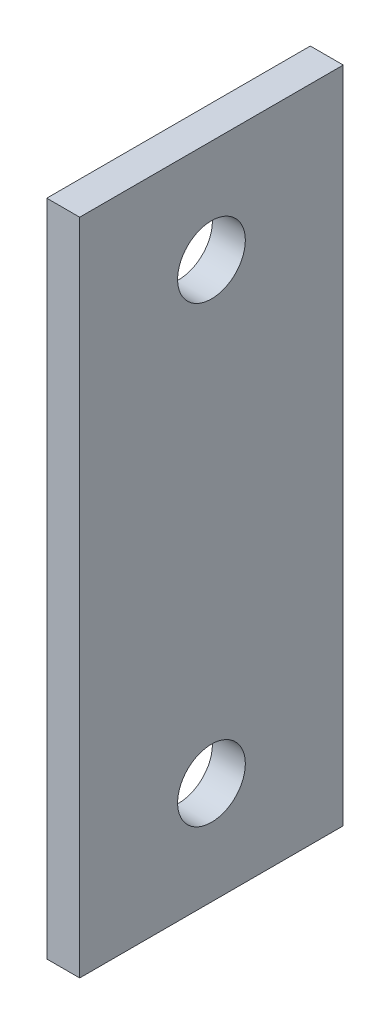
ISO-10303-21;
HEADER;
FILE_DESCRIPTION(('STEP AP214'),'2;1');
FILE_NAME('part.step','',(''),(''),'','','');
FILE_SCHEMA(('AUTOMOTIVE_DESIGN { 1 0 10303 214 1 1 1 1 }'));
ENDSEC;
DATA;
#1=APPLICATION_CONTEXT('core data for automotive mechanical design processes');
#2=APPLICATION_PROTOCOL_DEFINITION('international standard','automotive_design',2000,#1);
#3=PRODUCT_CONTEXT('',#1,'mechanical');
#4=PRODUCT('Part','Part','',(#3));
#5=PRODUCT_RELATED_PRODUCT_CATEGORY('part','',(#4));
#6=PRODUCT_DEFINITION_FORMATION('','',#4);
#7=PRODUCT_DEFINITION_CONTEXT('part definition',#1,'design');
#8=PRODUCT_DEFINITION('design','',#6,#7);
#9=PRODUCT_DEFINITION_SHAPE('','',#8);
#10=(LENGTH_UNIT() NAMED_UNIT(*) SI_UNIT(.MILLI.,.METRE.));
#11=(NAMED_UNIT(*) PLANE_ANGLE_UNIT() SI_UNIT($,.RADIAN.));
#12=(NAMED_UNIT(*) SI_UNIT($,.STERADIAN.) SOLID_ANGLE_UNIT());
#13=UNCERTAINTY_MEASURE_WITH_UNIT(LENGTH_MEASURE(1.E-05),#10,'distance_accuracy_value','');
#14=(GEOMETRIC_REPRESENTATION_CONTEXT(3) GLOBAL_UNCERTAINTY_ASSIGNED_CONTEXT((#13)) GLOBAL_UNIT_ASSIGNED_CONTEXT((#10,
#11,#12)) REPRESENTATION_CONTEXT('',''));
#15=CARTESIAN_POINT('',(0.,0.,0.));
#16=DIRECTION('',(0.,0.,1.));
#17=DIRECTION('',(1.,0.,0.));
#18=AXIS2_PLACEMENT_3D('',#15,#16,#17);
#19=CARTESIAN_POINT('',(3.175,0.,0.));
#20=DIRECTION('',(-1.,0.,0.));
#21=DIRECTION('',(0.,0.,1.));
#22=AXIS2_PLACEMENT_3D('',#19,#20,#21);
#23=PLANE('',#22);
#24=DIRECTION('',(0.,1.,0.));
#25=VECTOR('',#24,1.);
#26=CARTESIAN_POINT('',(3.175,-31.75,-12.7));
#27=LINE('',#26,#25);
#28=CARTESIAN_POINT('',(3.175,-31.75,-12.7));
#29=VERTEX_POINT('',#28);
#30=CARTESIAN_POINT('',(3.175,31.75,-12.7));
#31=VERTEX_POINT('',#30);
#32=EDGE_CURVE('E98',#29,#31,#27,.T.);
#33=ORIENTED_EDGE('',*,*,#32,.T.);
#34=DIRECTION('',(0.,0.,1.));
#35=VECTOR('',#34,1.);
#36=CARTESIAN_POINT('',(3.175,31.75,12.7));
#37=LINE('',#36,#35);
#38=CARTESIAN_POINT('',(3.175,31.75,12.7));
#39=VERTEX_POINT('',#38);
#40=EDGE_CURVE('E93',#31,#39,#37,.T.);
#41=ORIENTED_EDGE('',*,*,#40,.T.);
#42=DIRECTION('',(0.,-1.,0.));
#43=VECTOR('',#42,1.);
#44=CARTESIAN_POINT('',(3.175,-31.75,12.7));
#45=LINE('',#44,#43);
#46=CARTESIAN_POINT('',(3.175,-31.75,12.7));
#47=VERTEX_POINT('',#46);
#48=EDGE_CURVE('E96',#39,#47,#45,.T.);
#49=ORIENTED_EDGE('',*,*,#48,.T.);
#50=DIRECTION('',(0.,0.,-1.));
#51=VECTOR('',#50,1.);
#52=CARTESIAN_POINT('',(3.175,-31.75,12.7));
#53=LINE('',#52,#51);
#54=EDGE_CURVE('E63',#47,#29,#53,.T.);
#55=ORIENTED_EDGE('',*,*,#54,.T.);
#56=EDGE_LOOP('',(#33,#41,#49,#55));
#57=FACE_BOUND('',#56,.T.);
#58=CARTESIAN_POINT('',(3.175,21.844,0.));
#59=DIRECTION('',(1.,0.,0.));
#60=DIRECTION('',(0.,0.,-1.));
#61=AXIS2_PLACEMENT_3D('',#58,#59,#60);
#62=CIRCLE('',#61,3.2639);
#63=CARTESIAN_POINT('',(3.175,21.844,-3.2639));
#64=VERTEX_POINT('',#63);
#65=EDGE_CURVE('E118',#64,#64,#62,.T.);
#66=ORIENTED_EDGE('',*,*,#65,.F.);
#67=EDGE_LOOP('',(#66));
#68=FACE_BOUND('',#67,.T.);
#69=CARTESIAN_POINT('',(3.175,-21.844,0.));
#70=DIRECTION('',(1.,0.,0.));
#71=DIRECTION('',(0.,0.,-1.));
#72=AXIS2_PLACEMENT_3D('',#69,#70,#71);
#73=CIRCLE('',#72,3.2639);
#74=CARTESIAN_POINT('',(3.175,-21.844,-3.2639));
#75=VERTEX_POINT('',#74);
#76=EDGE_CURVE('E140',#75,#75,#73,.T.);
#77=ORIENTED_EDGE('',*,*,#76,.F.);
#78=EDGE_LOOP('',(#77));
#79=FACE_BOUND('',#78,.T.);
#80=ADVANCED_FACE('F45',(#57,#68,#79),#23,.F.);
#81=CARTESIAN_POINT('',(0.,0.,0.));
#82=DIRECTION('',(-1.,0.,0.));
#83=DIRECTION('',(0.,0.,1.));
#84=AXIS2_PLACEMENT_3D('',#81,#82,#83);
#85=PLANE('',#84);
#86=CARTESIAN_POINT('',(0.,21.844,0.));
#87=DIRECTION('',(1.,0.,0.));
#88=DIRECTION('',(0.,0.,-1.));
#89=AXIS2_PLACEMENT_3D('',#86,#87,#88);
#90=CIRCLE('',#89,3.2639);
#91=CARTESIAN_POINT('',(0.,21.844,-3.2639));
#92=VERTEX_POINT('',#91);
#93=EDGE_CURVE('E136',#92,#92,#90,.T.);
#94=ORIENTED_EDGE('',*,*,#93,.T.);
#95=EDGE_LOOP('',(#94));
#96=FACE_BOUND('',#95,.T.);
#97=DIRECTION('',(0.,1.,0.));
#98=VECTOR('',#97,1.);
#99=CARTESIAN_POINT('',(0.,-31.75,-12.7));
#100=LINE('',#99,#98);
#101=CARTESIAN_POINT('',(0.,-31.75,-12.7));
#102=VERTEX_POINT('',#101);
#103=CARTESIAN_POINT('',(0.,31.75,-12.7));
#104=VERTEX_POINT('',#103);
#105=EDGE_CURVE('E114',#102,#104,#100,.T.);
#106=ORIENTED_EDGE('',*,*,#105,.F.);
#107=DIRECTION('',(0.,0.,-1.));
#108=VECTOR('',#107,1.);
#109=CARTESIAN_POINT('',(0.,-31.75,12.7));
#110=LINE('',#109,#108);
#111=CARTESIAN_POINT('',(0.,-31.75,12.7));
#112=VERTEX_POINT('',#111);
#113=EDGE_CURVE('E86',#112,#102,#110,.T.);
#114=ORIENTED_EDGE('',*,*,#113,.F.);
#115=DIRECTION('',(0.,-1.,0.));
#116=VECTOR('',#115,1.);
#117=CARTESIAN_POINT('',(0.,-31.75,12.7));
#118=LINE('',#117,#116);
#119=CARTESIAN_POINT('',(0.,31.75,12.7));
#120=VERTEX_POINT('',#119);
#121=EDGE_CURVE('E80',#120,#112,#118,.T.);
#122=ORIENTED_EDGE('',*,*,#121,.F.);
#123=DIRECTION('',(0.,0.,1.));
#124=VECTOR('',#123,1.);
#125=CARTESIAN_POINT('',(0.,31.75,12.7));
#126=LINE('',#125,#124);
#127=EDGE_CURVE('E103',#104,#120,#126,.T.);
#128=ORIENTED_EDGE('',*,*,#127,.F.);
#129=EDGE_LOOP('',(#106,#114,#122,#128));
#130=FACE_BOUND('',#129,.T.);
#131=CARTESIAN_POINT('',(0.,-21.844,0.));
#132=DIRECTION('',(1.,0.,0.));
#133=DIRECTION('',(0.,0.,-1.));
#134=AXIS2_PLACEMENT_3D('',#131,#132,#133);
#135=CIRCLE('',#134,3.2639);
#136=CARTESIAN_POINT('',(0.,-21.844,-3.2639));
#137=VERTEX_POINT('',#136);
#138=EDGE_CURVE('E144',#137,#137,#135,.T.);
#139=ORIENTED_EDGE('',*,*,#138,.T.);
#140=EDGE_LOOP('',(#139));
#141=FACE_BOUND('',#140,.T.);
#142=ADVANCED_FACE('F131',(#96,#130,#141),#85,.T.);
#143=CARTESIAN_POINT('',(3.175,-31.75,-12.7));
#144=DIRECTION('',(0.,0.,1.));
#145=DIRECTION('',(1.,0.,0.));
#146=AXIS2_PLACEMENT_3D('',#143,#144,#145);
#147=PLANE('',#146);
#148=ORIENTED_EDGE('',*,*,#105,.T.);
#149=DIRECTION('',(-1.,0.,0.));
#150=VECTOR('',#149,1.);
#151=CARTESIAN_POINT('',(3.175,31.75,-12.7));
#152=LINE('',#151,#150);
#153=EDGE_CURVE('E11',#31,#104,#152,.T.);
#154=ORIENTED_EDGE('',*,*,#153,.F.);
#155=ORIENTED_EDGE('',*,*,#32,.F.);
#156=DIRECTION('',(-1.,0.,0.));
#157=VECTOR('',#156,1.);
#158=CARTESIAN_POINT('',(3.175,-31.75,-12.7));
#159=LINE('',#158,#157);
#160=EDGE_CURVE('E110',#29,#102,#159,.T.);
#161=ORIENTED_EDGE('',*,*,#160,.T.);
#162=EDGE_LOOP('',(#148,#154,#155,#161));
#163=FACE_BOUND('',#162,.T.);
#164=ADVANCED_FACE('F47',(#163),#147,.F.);
#165=CARTESIAN_POINT('',(3.175,31.75,12.7));
#166=DIRECTION('',(0.,-1.,0.));
#167=DIRECTION('',(0.,0.,-1.));
#168=AXIS2_PLACEMENT_3D('',#165,#166,#167);
#169=PLANE('',#168);
#170=ORIENTED_EDGE('',*,*,#127,.T.);
#171=DIRECTION('',(-1.,0.,0.));
#172=VECTOR('',#171,1.);
#173=CARTESIAN_POINT('',(3.175,31.75,12.7));
#174=LINE('',#173,#172);
#175=EDGE_CURVE('E55',#39,#120,#174,.T.);
#176=ORIENTED_EDGE('',*,*,#175,.F.);
#177=ORIENTED_EDGE('',*,*,#40,.F.);
#178=ORIENTED_EDGE('',*,*,#153,.T.);
#179=EDGE_LOOP('',(#170,#176,#177,#178));
#180=FACE_BOUND('',#179,.T.);
#181=ADVANCED_FACE('F102',(#180),#169,.F.);
#182=CARTESIAN_POINT('',(3.175,-31.75,12.7));
#183=DIRECTION('',(0.,0.,-1.));
#184=DIRECTION('',(-1.,0.,0.));
#185=AXIS2_PLACEMENT_3D('',#182,#183,#184);
#186=PLANE('',#185);
#187=ORIENTED_EDGE('',*,*,#121,.T.);
#188=DIRECTION('',(-1.,0.,0.));
#189=VECTOR('',#188,1.);
#190=CARTESIAN_POINT('',(3.175,-31.75,12.7));
#191=LINE('',#190,#189);
#192=EDGE_CURVE('E105',#47,#112,#191,.T.);
#193=ORIENTED_EDGE('',*,*,#192,.F.);
#194=ORIENTED_EDGE('',*,*,#48,.F.);
#195=ORIENTED_EDGE('',*,*,#175,.T.);
#196=EDGE_LOOP('',(#187,#193,#194,#195));
#197=FACE_BOUND('',#196,.T.);
#198=ADVANCED_FACE('F106',(#197),#186,.F.);
#199=CARTESIAN_POINT('',(3.175,-31.75,12.7));
#200=DIRECTION('',(0.,1.,0.));
#201=DIRECTION('',(0.,0.,1.));
#202=AXIS2_PLACEMENT_3D('',#199,#200,#201);
#203=PLANE('',#202);
#204=ORIENTED_EDGE('',*,*,#113,.T.);
#205=ORIENTED_EDGE('',*,*,#160,.F.);
#206=ORIENTED_EDGE('',*,*,#54,.F.);
#207=ORIENTED_EDGE('',*,*,#192,.T.);
#208=EDGE_LOOP('',(#204,#205,#206,#207));
#209=FACE_BOUND('',#208,.T.);
#210=ADVANCED_FACE('F128',(#209),#203,.F.);
#211=CARTESIAN_POINT('',(3.175,21.844,0.));
#212=DIRECTION('',(-1.,0.,0.));
#213=DIRECTION('',(0.,0.,1.));
#214=AXIS2_PLACEMENT_3D('',#211,#212,#213);
#215=CYLINDRICAL_SURFACE('',#214,3.2639);
#216=ORIENTED_EDGE('',*,*,#65,.T.);
#217=EDGE_LOOP('',(#216));
#218=FACE_BOUND('',#217,.T.);
#219=ORIENTED_EDGE('',*,*,#93,.F.);
#220=EDGE_LOOP('',(#219));
#221=FACE_BOUND('',#220,.T.);
#222=ADVANCED_FACE('F163',(#218,#221),#215,.F.);
#223=CARTESIAN_POINT('',(3.175,-21.844,0.));
#224=DIRECTION('',(-1.,0.,0.));
#225=DIRECTION('',(0.,0.,1.));
#226=AXIS2_PLACEMENT_3D('',#223,#224,#225);
#227=CYLINDRICAL_SURFACE('',#226,3.2639);
#228=ORIENTED_EDGE('',*,*,#76,.T.);
#229=EDGE_LOOP('',(#228));
#230=FACE_BOUND('',#229,.T.);
#231=ORIENTED_EDGE('',*,*,#138,.F.);
#232=EDGE_LOOP('',(#231));
#233=FACE_BOUND('',#232,.T.);
#234=ADVANCED_FACE('F152',(#230,#233),#227,.F.);
#235=CLOSED_SHELL('',(#80,#142,#164,#181,#198,#210,#222,#234));
#236=MANIFOLD_SOLID_BREP('B2',#235);
#237=ADVANCED_BREP_SHAPE_REPRESENTATION('',(#18,#236),#14);
#238=SHAPE_DEFINITION_REPRESENTATION(#9,#237);
ENDSEC;
END-ISO-10303-21;
